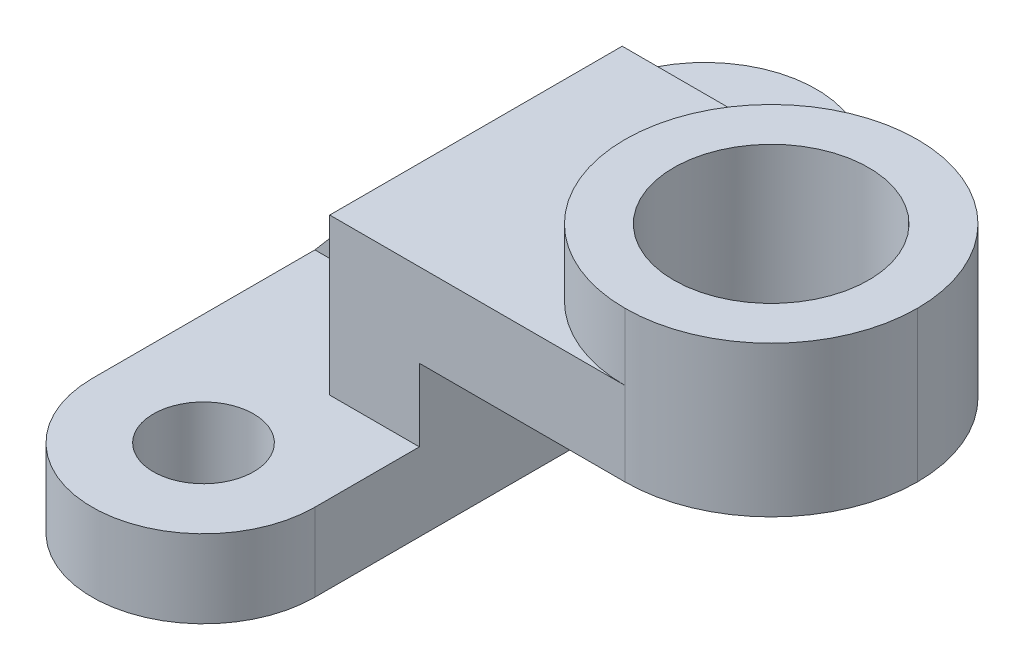
ISO-10303-21;
HEADER;
FILE_DESCRIPTION(('STEP AP214'),'2;1');
FILE_NAME('part.step','',(''),(''),'','','');
FILE_SCHEMA(('AUTOMOTIVE_DESIGN { 1 0 10303 214 1 1 1 1 }'));
ENDSEC;
DATA;
#1=APPLICATION_CONTEXT('core data for automotive mechanical design processes');
#2=APPLICATION_PROTOCOL_DEFINITION('international standard','automotive_design',2000,#1);
#3=PRODUCT_CONTEXT('',#1,'mechanical');
#4=PRODUCT('Part','Part','',(#3));
#5=PRODUCT_RELATED_PRODUCT_CATEGORY('part','',(#4));
#6=PRODUCT_DEFINITION_FORMATION('','',#4);
#7=PRODUCT_DEFINITION_CONTEXT('part definition',#1,'design');
#8=PRODUCT_DEFINITION('design','',#6,#7);
#9=PRODUCT_DEFINITION_SHAPE('','',#8);
#10=(LENGTH_UNIT() NAMED_UNIT(*) SI_UNIT(.MILLI.,.METRE.));
#11=(NAMED_UNIT(*) PLANE_ANGLE_UNIT() SI_UNIT($,.RADIAN.));
#12=(NAMED_UNIT(*) SI_UNIT($,.STERADIAN.) SOLID_ANGLE_UNIT());
#13=UNCERTAINTY_MEASURE_WITH_UNIT(LENGTH_MEASURE(1.E-05),#10,'distance_accuracy_value','');
#14=(GEOMETRIC_REPRESENTATION_CONTEXT(3) GLOBAL_UNCERTAINTY_ASSIGNED_CONTEXT((#13)) GLOBAL_UNIT_ASSIGNED_CONTEXT((#10,
#11,#12)) REPRESENTATION_CONTEXT('',''));
#15=CARTESIAN_POINT('',(0.,0.,0.));
#16=DIRECTION('',(0.,0.,1.));
#17=DIRECTION('',(1.,0.,0.));
#18=AXIS2_PLACEMENT_3D('',#15,#16,#17);
#19=CARTESIAN_POINT('',(-68.9044879536387,-51.4852491825803,52.5));
#20=DIRECTION('',(1.,0.,0.));
#21=DIRECTION('',(0.,1.,0.));
#22=AXIS2_PLACEMENT_3D('',#19,#20,#21);
#23=PLANE('',#22);
#24=DIRECTION('',(0.,-1.,0.));
#25=VECTOR('',#24,1.);
#26=CARTESIAN_POINT('',(-68.9044879536387,-51.4852491825803,-10.));
#27=LINE('',#26,#25);
#28=CARTESIAN_POINT('',(-68.9044879536387,4.51475081741969,-10.));
#29=VERTEX_POINT('',#28);
#30=CARTESIAN_POINT('',(-68.9044879536387,-51.4852491825803,-9.99999999999999));
#31=VERTEX_POINT('',#30);
#32=EDGE_CURVE('E166',#29,#31,#27,.T.);
#33=ORIENTED_EDGE('',*,*,#32,.F.);
#34=DIRECTION('',(0.,0.,-1.));
#35=VECTOR('',#34,1.);
#36=CARTESIAN_POINT('',(-68.9044879536387,4.51475081741969,52.5));
#37=LINE('',#36,#35);
#38=CARTESIAN_POINT('',(-68.9044879536387,4.51475081741969,-52.5));
#39=VERTEX_POINT('',#38);
#40=EDGE_CURVE('E175',#29,#39,#37,.T.);
#41=ORIENTED_EDGE('',*,*,#40,.T.);
#42=DIRECTION('',(0.,-1.,0.));
#43=VECTOR('',#42,1.);
#44=CARTESIAN_POINT('',(-68.9044879536387,-51.4852491825803,-52.5));
#45=LINE('',#44,#43);
#46=CARTESIAN_POINT('',(-68.9044879536387,-51.4852491825803,-52.5));
#47=VERTEX_POINT('',#46);
#48=EDGE_CURVE('E266',#39,#47,#45,.T.);
#49=ORIENTED_EDGE('',*,*,#48,.T.);
#50=DIRECTION('',(0.,0.,-1.));
#51=VECTOR('',#50,1.);
#52=CARTESIAN_POINT('',(-68.9044879536387,-51.4852491825803,52.5));
#53=LINE('',#52,#51);
#54=EDGE_CURVE('E177',#31,#47,#53,.T.);
#55=ORIENTED_EDGE('',*,*,#54,.F.);
#56=EDGE_LOOP('',(#33,#41,#49,#55));
#57=FACE_BOUND('',#56,.T.);
#58=ADVANCED_FACE('F39',(#57),#23,.F.);
#59=CARTESIAN_POINT('',(-76.7310912790545,-51.4852491825803,90.));
#60=DIRECTION('',(0.,-1.,0.));
#61=DIRECTION('',(0.,0.,-1.));
#62=AXIS2_PLACEMENT_3D('',#59,#60,#61);
#63=PLANE('',#62);
#64=CARTESIAN_POINT('',(-76.7310912790545,-51.4852491825803,-90.));
#65=DIRECTION('',(0.,-1.,0.));
#66=DIRECTION('',(0.,0.,-1.));
#67=AXIS2_PLACEMENT_3D('',#64,#65,#66);
#68=CIRCLE('',#67,18.);
#69=CARTESIAN_POINT('',(-76.7310912790545,-51.4852491825803,-108.));
#70=VERTEX_POINT('',#69);
#71=EDGE_CURVE('E160',#70,#70,#68,.T.);
#72=ORIENTED_EDGE('',*,*,#71,.T.);
#73=EDGE_LOOP('',(#72));
#74=FACE_BOUND('',#73,.T.);
#75=DIRECTION('',(-1.,0.,0.));
#76=VECTOR('',#75,1.);
#77=CARTESIAN_POINT('',(-76.7310912790545,-51.4852491825803,-9.99999999999999));
#78=LINE('',#77,#76);
#79=CARTESIAN_POINT('',(-116.731091279054,-51.4852491825803,-9.99999999999999));
#80=VERTEX_POINT('',#79);
#81=EDGE_CURVE('E168',#31,#80,#78,.T.);
#82=ORIENTED_EDGE('',*,*,#81,.F.);
#83=ORIENTED_EDGE('',*,*,#54,.T.);
#84=DIRECTION('',(1.,0.,0.));
#85=VECTOR('',#84,1.);
#86=CARTESIAN_POINT('',(-36.7310912790545,-51.4852491825803,-52.5));
#87=LINE('',#86,#85);
#88=CARTESIAN_POINT('',(-36.7310912790545,-51.4852491825803,-52.5));
#89=VERTEX_POINT('',#88);
#90=EDGE_CURVE('E241',#47,#89,#87,.T.);
#91=ORIENTED_EDGE('',*,*,#90,.T.);
#92=DIRECTION('',(0.,0.,1.));
#93=VECTOR('',#92,1.);
#94=CARTESIAN_POINT('',(-36.7310912790545,-51.4852491825803,90.));
#95=LINE('',#94,#93);
#96=CARTESIAN_POINT('',(-36.7310912790545,-51.4852491825803,-90.));
#97=VERTEX_POINT('',#96);
#98=EDGE_CURVE('E300',#97,#89,#95,.T.);
#99=ORIENTED_EDGE('',*,*,#98,.F.);
#100=CARTESIAN_POINT('',(-76.7310912790545,-51.4852491825803,-90.));
#101=DIRECTION('',(0.,-1.,0.));
#102=DIRECTION('',(0.,0.,-1.));
#103=AXIS2_PLACEMENT_3D('',#100,#101,#102);
#104=CIRCLE('',#103,40.);
#105=CARTESIAN_POINT('',(-116.731091279054,-51.4852491825803,-90.));
#106=VERTEX_POINT('',#105);
#107=EDGE_CURVE('E314',#106,#97,#104,.T.);
#108=ORIENTED_EDGE('',*,*,#107,.F.);
#109=DIRECTION('',(0.,0.,-1.));
#110=VECTOR('',#109,1.);
#111=CARTESIAN_POINT('',(-116.731091279054,-51.4852491825803,90.));
#112=LINE('',#111,#110);
#113=EDGE_CURVE('E526',#80,#106,#112,.T.);
#114=ORIENTED_EDGE('',*,*,#113,.F.);
#115=EDGE_LOOP('',(#82,#83,#91,#99,#108,#114));
#116=FACE_BOUND('',#115,.T.);
#117=ADVANCED_FACE('F290',(#74,#116),#63,.F.);
#118=CARTESIAN_POINT('',(-36.7310912790545,-25.4852491825803,52.5));
#119=DIRECTION('',(-1.,0.,0.));
#120=DIRECTION('',(0.,0.,1.));
#121=AXIS2_PLACEMENT_3D('',#118,#119,#120);
#122=PLANE('',#121);
#123=DIRECTION('',(0.,1.,0.));
#124=VECTOR('',#123,1.);
#125=CARTESIAN_POINT('',(-36.7310912790545,-79.4852491825803,90.));
#126=LINE('',#125,#124);
#127=CARTESIAN_POINT('',(-36.7310912790545,-79.4852491825803,90.));
#128=VERTEX_POINT('',#127);
#129=CARTESIAN_POINT('',(-36.7310912790545,-51.4852491825803,90.));
#130=VERTEX_POINT('',#129);
#131=EDGE_CURVE('E318',#128,#130,#126,.T.);
#132=ORIENTED_EDGE('',*,*,#131,.F.);
#133=DIRECTION('',(0.,0.,1.));
#134=VECTOR('',#133,1.);
#135=CARTESIAN_POINT('',(-36.7310912790545,-79.4852491825803,90.));
#136=LINE('',#135,#134);
#137=CARTESIAN_POINT('',(-36.7310912790545,-79.4852491825803,-90.));
#138=VERTEX_POINT('',#137);
#139=EDGE_CURVE('E322',#138,#128,#136,.T.);
#140=ORIENTED_EDGE('',*,*,#139,.F.);
#141=DIRECTION('',(0.,1.,0.));
#142=VECTOR('',#141,1.);
#143=CARTESIAN_POINT('',(-36.7310912790545,-79.4852491825803,-90.));
#144=LINE('',#143,#142);
#145=EDGE_CURVE('E303',#138,#97,#144,.T.);
#146=ORIENTED_EDGE('',*,*,#145,.T.);
#147=ORIENTED_EDGE('',*,*,#98,.T.);
#148=DIRECTION('',(0.,1.,0.));
#149=VECTOR('',#148,1.);
#150=CARTESIAN_POINT('',(-36.7310912790545,-25.4852491825803,-52.5));
#151=LINE('',#150,#149);
#152=CARTESIAN_POINT('',(-36.7310912790545,-25.4852491825803,-52.5));
#153=VERTEX_POINT('',#152);
#154=EDGE_CURVE('E248',#89,#153,#151,.T.);
#155=ORIENTED_EDGE('',*,*,#154,.T.);
#156=DIRECTION('',(0.,0.,-1.));
#157=VECTOR('',#156,1.);
#158=CARTESIAN_POINT('',(-36.7310912790545,-25.4852491825803,52.5));
#159=LINE('',#158,#157);
#160=CARTESIAN_POINT('',(-36.7310912790545,-25.4852491825803,52.5));
#161=VERTEX_POINT('',#160);
#162=EDGE_CURVE('E191',#161,#153,#159,.T.);
#163=ORIENTED_EDGE('',*,*,#162,.F.);
#164=DIRECTION('',(0.,1.,0.));
#165=VECTOR('',#164,1.);
#166=CARTESIAN_POINT('',(-36.7310912790545,-25.4852491825803,52.5));
#167=LINE('',#166,#165);
#168=CARTESIAN_POINT('',(-36.7310912790545,-51.4852491825803,52.5));
#169=VERTEX_POINT('',#168);
#170=EDGE_CURVE('E271',#169,#161,#167,.T.);
#171=ORIENTED_EDGE('',*,*,#170,.F.);
#172=EDGE_CURVE('E307',#169,#130,#95,.T.);
#173=ORIENTED_EDGE('',*,*,#172,.T.);
#174=EDGE_LOOP('',(#132,#140,#146,#147,#155,#163,#171,#173));
#175=FACE_BOUND('',#174,.T.);
#176=ADVANCED_FACE('F297',(#175),#122,.F.);
#177=CARTESIAN_POINT('',(89.5955120463612,-25.4852491825803,52.5));
#178=DIRECTION('',(0.,1.,0.));
#179=DIRECTION('',(-1.,0.,0.));
#180=AXIS2_PLACEMENT_3D('',#177,#178,#179);
#181=PLANE('',#180);
#182=CARTESIAN_POINT('',(37.0955120463612,-25.4852491825803,0.));
#183=DIRECTION('',(0.,1.,0.));
#184=DIRECTION('',(-1.,0.,0.));
#185=AXIS2_PLACEMENT_3D('',#182,#183,#184);
#186=CIRCLE('',#185,35.);
#187=CARTESIAN_POINT('',(2.09551204636123,-25.4852491825803,0.));
#188=VERTEX_POINT('',#187);
#189=EDGE_CURVE('E230',#188,#188,#186,.T.);
#190=ORIENTED_EDGE('',*,*,#189,.T.);
#191=EDGE_LOOP('',(#190));
#192=FACE_BOUND('',#191,.T.);
#193=ORIENTED_EDGE('',*,*,#162,.T.);
#194=DIRECTION('',(1.,0.,0.));
#195=VECTOR('',#194,1.);
#196=CARTESIAN_POINT('',(89.5955120463612,-25.4852491825803,-52.5));
#197=LINE('',#196,#195);
#198=CARTESIAN_POINT('',(37.0955120463612,-25.4852491825803,-52.5));
#199=VERTEX_POINT('',#198);
#200=EDGE_CURVE('E256',#153,#199,#197,.T.);
#201=ORIENTED_EDGE('',*,*,#200,.T.);
#202=CARTESIAN_POINT('',(37.0955120463612,-25.4852491825803,0.));
#203=DIRECTION('',(0.,1.,0.));
#204=DIRECTION('',(-1.,0.,0.));
#205=AXIS2_PLACEMENT_3D('',#202,#203,#204);
#206=CIRCLE('',#205,52.5);
#207=CARTESIAN_POINT('',(89.5955120463612,-25.4852491825803,0.));
#208=VERTEX_POINT('',#207);
#209=EDGE_CURVE('E217',#199,#208,#206,.F.);
#210=ORIENTED_EDGE('',*,*,#209,.T.);
#211=CARTESIAN_POINT('',(37.0955120463612,-25.4852491825803,0.));
#212=DIRECTION('',(0.,1.,0.));
#213=DIRECTION('',(-1.,0.,0.));
#214=AXIS2_PLACEMENT_3D('',#211,#212,#213);
#215=CIRCLE('',#214,52.5);
#216=CARTESIAN_POINT('',(37.0955120463612,-25.4852491825803,52.5));
#217=VERTEX_POINT('',#216);
#218=EDGE_CURVE('E220',#208,#217,#215,.F.);
#219=ORIENTED_EDGE('',*,*,#218,.T.);
#220=DIRECTION('',(1.,0.,0.));
#221=VECTOR('',#220,1.);
#222=CARTESIAN_POINT('',(89.5955120463612,-25.4852491825803,52.5));
#223=LINE('',#222,#221);
#224=EDGE_CURVE('E277',#161,#217,#223,.T.);
#225=ORIENTED_EDGE('',*,*,#224,.F.);
#226=EDGE_LOOP('',(#193,#201,#210,#219,#225));
#227=FACE_BOUND('',#226,.T.);
#228=ADVANCED_FACE('F341',(#192,#227),#181,.F.);
#229=CARTESIAN_POINT('',(-15.4044879536388,28.5147508174197,52.5));
#230=DIRECTION('',(0.,-1.,0.));
#231=DIRECTION('',(0.,0.,-1.));
#232=AXIS2_PLACEMENT_3D('',#229,#230,#231);
#233=PLANE('',#232);
#234=CARTESIAN_POINT('',(37.0955120463612,28.5147508174197,0.));
#235=DIRECTION('',(0.,1.,0.));
#236=DIRECTION('',(0.,0.,1.));
#237=AXIS2_PLACEMENT_3D('',#234,#235,#236);
#238=CIRCLE('',#237,35.);
#239=CARTESIAN_POINT('',(37.0955120463612,28.5147508174197,35.));
#240=VERTEX_POINT('',#239);
#241=EDGE_CURVE('E332',#240,#240,#238,.T.);
#242=ORIENTED_EDGE('',*,*,#241,.F.);
#243=EDGE_LOOP('',(#242));
#244=FACE_BOUND('',#243,.T.);
#245=CARTESIAN_POINT('',(37.0955120463612,28.5147508174197,0.));
#246=DIRECTION('',(0.,-1.,0.));
#247=DIRECTION('',(0.,0.,-1.));
#248=AXIS2_PLACEMENT_3D('',#245,#246,#247);
#249=CIRCLE('',#248,52.5);
#250=CARTESIAN_POINT('',(37.0955120463612,28.5147508174197,52.5));
#251=VERTEX_POINT('',#250);
#252=CARTESIAN_POINT('',(89.5955120463612,28.5147508174197,0.));
#253=VERTEX_POINT('',#252);
#254=EDGE_CURVE('E204',#251,#253,#249,.F.);
#255=ORIENTED_EDGE('',*,*,#254,.T.);
#256=CARTESIAN_POINT('',(37.0955120463612,28.5147508174197,0.));
#257=DIRECTION('',(0.,-1.,0.));
#258=DIRECTION('',(0.,0.,-1.));
#259=AXIS2_PLACEMENT_3D('',#256,#257,#258);
#260=CIRCLE('',#259,52.5);
#261=CARTESIAN_POINT('',(37.0955120463612,28.5147508174197,-52.5));
#262=VERTEX_POINT('',#261);
#263=EDGE_CURVE('E201',#253,#262,#260,.F.);
#264=ORIENTED_EDGE('',*,*,#263,.T.);
#265=CARTESIAN_POINT('',(37.0955120463612,28.5147508174197,0.));
#266=DIRECTION('',(0.,-1.,0.));
#267=DIRECTION('',(0.,0.,-1.));
#268=AXIS2_PLACEMENT_3D('',#265,#266,#267);
#269=CIRCLE('',#268,52.5);
#270=CARTESIAN_POINT('',(-15.4044879536388,28.5147508174197,0.));
#271=VERTEX_POINT('',#270);
#272=EDGE_CURVE('E210',#262,#271,#269,.F.);
#273=ORIENTED_EDGE('',*,*,#272,.T.);
#274=CARTESIAN_POINT('',(37.0955120463612,28.5147508174197,0.));
#275=DIRECTION('',(0.,-1.,0.));
#276=DIRECTION('',(0.,0.,-1.));
#277=AXIS2_PLACEMENT_3D('',#274,#275,#276);
#278=CIRCLE('',#277,52.5);
#279=EDGE_CURVE('E207',#271,#251,#278,.F.);
#280=ORIENTED_EDGE('',*,*,#279,.T.);
#281=EDGE_LOOP('',(#255,#264,#273,#280));
#282=FACE_BOUND('',#281,.T.);
#283=ADVANCED_FACE('F377',(#244,#282),#233,.F.);
#284=CARTESIAN_POINT('',(-68.9044879536387,4.51475081741969,52.5));
#285=DIRECTION('',(0.,-1.,0.));
#286=DIRECTION('',(0.,0.,-1.));
#287=AXIS2_PLACEMENT_3D('',#284,#285,#286);
#288=PLANE('',#287);
#289=CARTESIAN_POINT('',(37.0955120463612,4.51475081741969,0.));
#290=DIRECTION('',(0.,-1.,0.));
#291=DIRECTION('',(0.,0.,-1.));
#292=AXIS2_PLACEMENT_3D('',#289,#290,#291);
#293=CIRCLE('',#292,52.5);
#294=CARTESIAN_POINT('',(37.0955120463612,4.51475081741969,52.5));
#295=VERTEX_POINT('',#294);
#296=CARTESIAN_POINT('',(-15.4044879536388,4.51475081741969,0.));
#297=VERTEX_POINT('',#296);
#298=EDGE_CURVE('E11',#295,#297,#293,.T.);
#299=ORIENTED_EDGE('',*,*,#298,.T.);
#300=CARTESIAN_POINT('',(37.0955120463612,4.51475081741969,0.));
#301=DIRECTION('',(0.,-1.,0.));
#302=DIRECTION('',(0.,0.,-1.));
#303=AXIS2_PLACEMENT_3D('',#300,#301,#302);
#304=CIRCLE('',#303,52.5);
#305=CARTESIAN_POINT('',(37.0955120463612,4.51475081741969,-52.5));
#306=VERTEX_POINT('',#305);
#307=EDGE_CURVE('E49',#297,#306,#304,.T.);
#308=ORIENTED_EDGE('',*,*,#307,.T.);
#309=DIRECTION('',(-1.,0.,0.));
#310=VECTOR('',#309,1.);
#311=CARTESIAN_POINT('',(-68.9044879536387,4.51475081741969,-52.5));
#312=LINE('',#311,#310);
#313=EDGE_CURVE('E183',#306,#39,#312,.T.);
#314=ORIENTED_EDGE('',*,*,#313,.T.);
#315=ORIENTED_EDGE('',*,*,#40,.F.);
#316=DIRECTION('',(0.,0.,1.));
#317=VECTOR('',#316,1.);
#318=CARTESIAN_POINT('',(-68.9044879536387,4.51475081741969,52.5));
#319=LINE('',#318,#317);
#320=CARTESIAN_POINT('',(-68.9044879536387,4.51475081741969,10.));
#321=VERTEX_POINT('',#320);
#322=EDGE_CURVE('E152',#29,#321,#319,.T.);
#323=ORIENTED_EDGE('',*,*,#322,.T.);
#324=CARTESIAN_POINT('',(-68.9044879536387,4.51475081741969,52.5));
#325=VERTEX_POINT('',#324);
#326=EDGE_CURVE('E186',#325,#321,#37,.T.);
#327=ORIENTED_EDGE('',*,*,#326,.F.);
#328=DIRECTION('',(-1.,0.,0.));
#329=VECTOR('',#328,1.);
#330=CARTESIAN_POINT('',(-68.9044879536387,4.51475081741969,52.5));
#331=LINE('',#330,#329);
#332=EDGE_CURVE('E284',#295,#325,#331,.T.);
#333=ORIENTED_EDGE('',*,*,#332,.F.);
#334=EDGE_LOOP('',(#299,#308,#314,#315,#323,#327,#333));
#335=FACE_BOUND('',#334,.T.);
#336=ADVANCED_FACE('F181',(#335),#288,.F.);
#337=ORIENTED_EDGE('',*,*,#326,.T.);
#338=DIRECTION('',(0.,-1.,0.));
#339=VECTOR('',#338,1.);
#340=CARTESIAN_POINT('',(-68.9044879536387,-51.4852491825803,10.));
#341=LINE('',#340,#339);
#342=CARTESIAN_POINT('',(-68.9044879536387,-51.4852491825803,9.99999999999999));
#343=VERTEX_POINT('',#342);
#344=EDGE_CURVE('E161',#321,#343,#341,.T.);
#345=ORIENTED_EDGE('',*,*,#344,.T.);
#346=CARTESIAN_POINT('',(-68.9044879536387,-51.4852491825803,52.5));
#347=VERTEX_POINT('',#346);
#348=EDGE_CURVE('E187',#347,#343,#53,.T.);
#349=ORIENTED_EDGE('',*,*,#348,.F.);
#350=DIRECTION('',(0.,-1.,0.));
#351=VECTOR('',#350,1.);
#352=CARTESIAN_POINT('',(-68.9044879536387,-51.4852491825803,52.5));
#353=LINE('',#352,#351);
#354=EDGE_CURVE('E259',#325,#347,#353,.T.);
#355=ORIENTED_EDGE('',*,*,#354,.F.);
#356=EDGE_LOOP('',(#337,#345,#349,#355));
#357=FACE_BOUND('',#356,.T.);
#358=ADVANCED_FACE('F363',(#357),#23,.F.);
#359=CARTESIAN_POINT('',(0.,0.,52.5));
#360=DIRECTION('',(0.,0.,-1.));
#361=DIRECTION('',(-1.,0.,0.));
#362=AXIS2_PLACEMENT_3D('',#359,#360,#361);
#363=PLANE('',#362);
#364=DIRECTION('',(0.,1.,0.));
#365=VECTOR('',#364,1.);
#366=CARTESIAN_POINT('',(37.0955120463612,0.,52.5));
#367=LINE('',#366,#365);
#368=EDGE_CURVE('E213',#217,#295,#367,.T.);
#369=ORIENTED_EDGE('',*,*,#368,.T.);
#370=ORIENTED_EDGE('',*,*,#332,.T.);
#371=ORIENTED_EDGE('',*,*,#354,.T.);
#372=DIRECTION('',(1.,0.,0.));
#373=VECTOR('',#372,1.);
#374=CARTESIAN_POINT('',(-36.7310912790545,-51.4852491825803,52.5));
#375=LINE('',#374,#373);
#376=EDGE_CURVE('E268',#347,#169,#375,.T.);
#377=ORIENTED_EDGE('',*,*,#376,.T.);
#378=ORIENTED_EDGE('',*,*,#170,.T.);
#379=ORIENTED_EDGE('',*,*,#224,.T.);
#380=EDGE_LOOP('',(#369,#370,#371,#377,#378,#379));
#381=FACE_BOUND('',#380,.T.);
#382=ADVANCED_FACE('F371',(#381),#363,.F.);
#383=CARTESIAN_POINT('',(0.,0.,-52.5));
#384=DIRECTION('',(0.,0.,-1.));
#385=DIRECTION('',(-1.,0.,0.));
#386=AXIS2_PLACEMENT_3D('',#383,#384,#385);
#387=PLANE('',#386);
#388=ORIENTED_EDGE('',*,*,#313,.F.);
#389=DIRECTION('',(0.,1.,0.));
#390=VECTOR('',#389,1.);
#391=CARTESIAN_POINT('',(37.0955120463612,-25.4852491825803,-52.5));
#392=LINE('',#391,#390);
#393=EDGE_CURVE('E198',#306,#199,#392,.F.);
#394=ORIENTED_EDGE('',*,*,#393,.T.);
#395=ORIENTED_EDGE('',*,*,#200,.F.);
#396=ORIENTED_EDGE('',*,*,#154,.F.);
#397=ORIENTED_EDGE('',*,*,#90,.F.);
#398=ORIENTED_EDGE('',*,*,#48,.F.);
#399=EDGE_LOOP('',(#388,#394,#395,#396,#397,#398));
#400=FACE_BOUND('',#399,.T.);
#401=ADVANCED_FACE('F292',(#400),#387,.T.);
#402=CARTESIAN_POINT('',(37.0955120463612,0.,0.));
#403=DIRECTION('',(0.,1.,0.));
#404=DIRECTION('',(0.,0.,1.));
#405=AXIS2_PLACEMENT_3D('',#402,#403,#404);
#406=CYLINDRICAL_SURFACE('',#405,52.5);
#407=ORIENTED_EDGE('',*,*,#368,.F.);
#408=ORIENTED_EDGE('',*,*,#218,.F.);
#409=DIRECTION('',(0.,1.,0.));
#410=VECTOR('',#409,1.);
#411=CARTESIAN_POINT('',(89.5955120463612,28.5147508174197,0.));
#412=LINE('',#411,#410);
#413=EDGE_CURVE('E43',#253,#208,#412,.F.);
#414=ORIENTED_EDGE('',*,*,#413,.F.);
#415=ORIENTED_EDGE('',*,*,#254,.F.);
#416=DIRECTION('',(0.,1.,0.));
#417=VECTOR('',#416,1.);
#418=CARTESIAN_POINT('',(37.0955120463612,0.,52.5));
#419=LINE('',#418,#417);
#420=EDGE_CURVE('E233',#295,#251,#419,.T.);
#421=ORIENTED_EDGE('',*,*,#420,.F.);
#422=EDGE_LOOP('',(#407,#408,#414,#415,#421));
#423=FACE_BOUND('',#422,.T.);
#424=ADVANCED_FACE('F41',(#423),#406,.T.);
#425=CARTESIAN_POINT('',(37.0955120463612,28.5147508174197,0.));
#426=DIRECTION('',(0.,-1.,0.));
#427=DIRECTION('',(0.,0.,-1.));
#428=AXIS2_PLACEMENT_3D('',#425,#426,#427);
#429=CYLINDRICAL_SURFACE('',#428,52.5);
#430=ORIENTED_EDGE('',*,*,#413,.T.);
#431=ORIENTED_EDGE('',*,*,#209,.F.);
#432=ORIENTED_EDGE('',*,*,#393,.F.);
#433=DIRECTION('',(0.,1.,0.));
#434=VECTOR('',#433,1.);
#435=CARTESIAN_POINT('',(37.0955120463612,-25.4852491825803,-52.5));
#436=LINE('',#435,#434);
#437=EDGE_CURVE('E229',#262,#306,#436,.F.);
#438=ORIENTED_EDGE('',*,*,#437,.F.);
#439=ORIENTED_EDGE('',*,*,#263,.F.);
#440=EDGE_LOOP('',(#430,#431,#432,#438,#439));
#441=FACE_BOUND('',#440,.T.);
#442=ADVANCED_FACE('F387',(#441),#429,.T.);
#443=CARTESIAN_POINT('',(37.0955120463612,0.,0.));
#444=DIRECTION('',(0.,-1.,0.));
#445=DIRECTION('',(0.,0.,-1.));
#446=AXIS2_PLACEMENT_3D('',#443,#444,#445);
#447=CYLINDRICAL_SURFACE('',#446,52.5);
#448=ORIENTED_EDGE('',*,*,#420,.T.);
#449=ORIENTED_EDGE('',*,*,#279,.F.);
#450=DIRECTION('',(0.,-1.,0.));
#451=VECTOR('',#450,1.);
#452=CARTESIAN_POINT('',(-15.4044879536388,4.51475081741969,0.));
#453=LINE('',#452,#451);
#454=EDGE_CURVE('E225',#297,#271,#453,.F.);
#455=ORIENTED_EDGE('',*,*,#454,.F.);
#456=ORIENTED_EDGE('',*,*,#298,.F.);
#457=EDGE_LOOP('',(#448,#449,#455,#456));
#458=FACE_BOUND('',#457,.T.);
#459=ADVANCED_FACE('F356',(#458),#447,.T.);
#460=CARTESIAN_POINT('',(37.0955120463612,4.51475081741969,0.));
#461=DIRECTION('',(0.,1.,0.));
#462=DIRECTION('',(0.,0.,1.));
#463=AXIS2_PLACEMENT_3D('',#460,#461,#462);
#464=CYLINDRICAL_SURFACE('',#463,52.5);
#465=ORIENTED_EDGE('',*,*,#454,.T.);
#466=ORIENTED_EDGE('',*,*,#272,.F.);
#467=ORIENTED_EDGE('',*,*,#437,.T.);
#468=ORIENTED_EDGE('',*,*,#307,.F.);
#469=EDGE_LOOP('',(#465,#466,#467,#468));
#470=FACE_BOUND('',#469,.T.);
#471=ADVANCED_FACE('F347',(#470),#464,.T.);
#472=CARTESIAN_POINT('',(37.0955120463612,-76.4852491825803,0.));
#473=DIRECTION('',(0.,1.,0.));
#474=DIRECTION('',(0.,0.,1.));
#475=AXIS2_PLACEMENT_3D('',#472,#473,#474);
#476=CYLINDRICAL_SURFACE('',#475,35.);
#477=ORIENTED_EDGE('',*,*,#189,.F.);
#478=EDGE_LOOP('',(#477));
#479=FACE_BOUND('',#478,.T.);
#480=ORIENTED_EDGE('',*,*,#241,.T.);
#481=EDGE_LOOP('',(#480));
#482=FACE_BOUND('',#481,.T.);
#483=ADVANCED_FACE('F344',(#479,#482),#476,.F.);
#484=CARTESIAN_POINT('',(-76.7310912790545,-51.4852491825803,90.));
#485=DIRECTION('',(0.,-1.,0.));
#486=DIRECTION('',(0.,0.,-1.));
#487=AXIS2_PLACEMENT_3D('',#484,#485,#486);
#488=CIRCLE('',#487,18.);
#489=CARTESIAN_POINT('',(-76.7310912790545,-51.4852491825803,72.));
#490=VERTEX_POINT('',#489);
#491=EDGE_CURVE('E534',#490,#490,#488,.T.);
#492=ORIENTED_EDGE('',*,*,#491,.T.);
#493=EDGE_LOOP('',(#492));
#494=FACE_BOUND('',#493,.T.);
#495=ORIENTED_EDGE('',*,*,#348,.T.);
#496=DIRECTION('',(-1.,0.,0.));
#497=VECTOR('',#496,1.);
#498=CARTESIAN_POINT('',(-76.7310912790545,-51.4852491825803,9.99999999999999));
#499=LINE('',#498,#497);
#500=CARTESIAN_POINT('',(-116.731091279054,-51.4852491825803,10.));
#501=VERTEX_POINT('',#500);
#502=EDGE_CURVE('E179',#343,#501,#499,.T.);
#503=ORIENTED_EDGE('',*,*,#502,.T.);
#504=CARTESIAN_POINT('',(-116.731091279054,-51.4852491825803,90.));
#505=VERTEX_POINT('',#504);
#506=EDGE_CURVE('E532',#505,#501,#112,.T.);
#507=ORIENTED_EDGE('',*,*,#506,.F.);
#508=CARTESIAN_POINT('',(-76.7310912790545,-51.4852491825803,90.));
#509=DIRECTION('',(0.,-1.,0.));
#510=DIRECTION('',(0.,0.,-1.));
#511=AXIS2_PLACEMENT_3D('',#508,#509,#510);
#512=CIRCLE('',#511,40.);
#513=EDGE_CURVE('E522',#130,#505,#512,.T.);
#514=ORIENTED_EDGE('',*,*,#513,.F.);
#515=ORIENTED_EDGE('',*,*,#172,.F.);
#516=ORIENTED_EDGE('',*,*,#376,.F.);
#517=EDGE_LOOP('',(#495,#503,#507,#514,#515,#516));
#518=FACE_BOUND('',#517,.T.);
#519=ADVANCED_FACE('F346',(#494,#518),#63,.F.);
#520=CARTESIAN_POINT('',(-76.7310912790545,-79.4852491825803,90.));
#521=DIRECTION('',(0.,-1.,0.));
#522=DIRECTION('',(0.,0.,-1.));
#523=AXIS2_PLACEMENT_3D('',#520,#521,#522);
#524=PLANE('',#523);
#525=DIRECTION('',(0.,0.,-1.));
#526=VECTOR('',#525,1.);
#527=CARTESIAN_POINT('',(-116.731091279054,-79.4852491825803,90.));
#528=LINE('',#527,#526);
#529=CARTESIAN_POINT('',(-116.731091279054,-79.4852491825803,90.));
#530=VERTEX_POINT('',#529);
#531=CARTESIAN_POINT('',(-116.731091279054,-79.4852491825803,-90.));
#532=VERTEX_POINT('',#531);
#533=EDGE_CURVE('E312',#530,#532,#528,.T.);
#534=ORIENTED_EDGE('',*,*,#533,.T.);
#535=CARTESIAN_POINT('',(-76.7310912790545,-79.4852491825803,-90.));
#536=DIRECTION('',(0.,-1.,0.));
#537=DIRECTION('',(0.,0.,-1.));
#538=AXIS2_PLACEMENT_3D('',#535,#536,#537);
#539=CIRCLE('',#538,40.);
#540=EDGE_CURVE('E564',#532,#138,#539,.T.);
#541=ORIENTED_EDGE('',*,*,#540,.T.);
#542=ORIENTED_EDGE('',*,*,#139,.T.);
#543=CARTESIAN_POINT('',(-76.7310912790545,-79.4852491825803,90.));
#544=DIRECTION('',(0.,-1.,0.));
#545=DIRECTION('',(0.,0.,-1.));
#546=AXIS2_PLACEMENT_3D('',#543,#544,#545);
#547=CIRCLE('',#546,40.);
#548=EDGE_CURVE('E306',#128,#530,#547,.T.);
#549=ORIENTED_EDGE('',*,*,#548,.T.);
#550=EDGE_LOOP('',(#534,#541,#542,#549));
#551=FACE_BOUND('',#550,.T.);
#552=CARTESIAN_POINT('',(-76.7310912790545,-79.4852491825803,90.));
#553=DIRECTION('',(0.,-1.,0.));
#554=DIRECTION('',(0.,0.,-1.));
#555=AXIS2_PLACEMENT_3D('',#552,#553,#554);
#556=CIRCLE('',#555,18.);
#557=CARTESIAN_POINT('',(-76.7310912790545,-79.4852491825803,72.));
#558=VERTEX_POINT('',#557);
#559=EDGE_CURVE('E527',#558,#558,#556,.T.);
#560=ORIENTED_EDGE('',*,*,#559,.F.);
#561=EDGE_LOOP('',(#560));
#562=FACE_BOUND('',#561,.T.);
#563=CARTESIAN_POINT('',(-76.7310912790545,-79.4852491825803,-90.));
#564=DIRECTION('',(0.,-1.,0.));
#565=DIRECTION('',(0.,0.,-1.));
#566=AXIS2_PLACEMENT_3D('',#563,#564,#565);
#567=CIRCLE('',#566,18.);
#568=CARTESIAN_POINT('',(-76.7310912790545,-79.4852491825803,-108.));
#569=VERTEX_POINT('',#568);
#570=EDGE_CURVE('E553',#569,#569,#567,.T.);
#571=ORIENTED_EDGE('',*,*,#570,.F.);
#572=EDGE_LOOP('',(#571));
#573=FACE_BOUND('',#572,.T.);
#574=ADVANCED_FACE('F353',(#551,#562,#573),#524,.T.);
#575=CARTESIAN_POINT('',(-76.7310912790545,-79.4852491825803,90.));
#576=DIRECTION('',(0.,1.,0.));
#577=DIRECTION('',(0.,0.,1.));
#578=AXIS2_PLACEMENT_3D('',#575,#576,#577);
#579=CYLINDRICAL_SURFACE('',#578,40.);
#580=ORIENTED_EDGE('',*,*,#513,.T.);
#581=DIRECTION('',(0.,1.,0.));
#582=VECTOR('',#581,1.);
#583=CARTESIAN_POINT('',(-116.731091279054,-79.4852491825803,90.));
#584=LINE('',#583,#582);
#585=EDGE_CURVE('E329',#530,#505,#584,.T.);
#586=ORIENTED_EDGE('',*,*,#585,.F.);
#587=ORIENTED_EDGE('',*,*,#548,.F.);
#588=ORIENTED_EDGE('',*,*,#131,.T.);
#589=EDGE_LOOP('',(#580,#586,#587,#588));
#590=FACE_BOUND('',#589,.T.);
#591=ADVANCED_FACE('F459',(#590),#579,.T.);
#592=CARTESIAN_POINT('',(-116.731091279054,-79.4852491825803,90.));
#593=DIRECTION('',(1.,0.,0.));
#594=DIRECTION('',(0.,0.,-1.));
#595=AXIS2_PLACEMENT_3D('',#592,#593,#594);
#596=PLANE('',#595);
#597=ORIENTED_EDGE('',*,*,#506,.T.);
#598=EDGE_CURVE('E531',#501,#80,#112,.T.);
#599=ORIENTED_EDGE('',*,*,#598,.T.);
#600=ORIENTED_EDGE('',*,*,#113,.T.);
#601=DIRECTION('',(0.,1.,0.));
#602=VECTOR('',#601,1.);
#603=CARTESIAN_POINT('',(-116.731091279054,-79.4852491825803,-90.));
#604=LINE('',#603,#602);
#605=EDGE_CURVE('E325',#532,#106,#604,.T.);
#606=ORIENTED_EDGE('',*,*,#605,.F.);
#607=ORIENTED_EDGE('',*,*,#533,.F.);
#608=ORIENTED_EDGE('',*,*,#585,.T.);
#609=EDGE_LOOP('',(#597,#599,#600,#606,#607,#608));
#610=FACE_BOUND('',#609,.T.);
#611=ADVANCED_FACE('F467',(#610),#596,.F.);
#612=CARTESIAN_POINT('',(-76.7310912790545,-79.4852491825803,-90.));
#613=DIRECTION('',(0.,1.,0.));
#614=DIRECTION('',(0.,0.,1.));
#615=AXIS2_PLACEMENT_3D('',#612,#613,#614);
#616=CYLINDRICAL_SURFACE('',#615,40.);
#617=ORIENTED_EDGE('',*,*,#107,.T.);
#618=ORIENTED_EDGE('',*,*,#145,.F.);
#619=ORIENTED_EDGE('',*,*,#540,.F.);
#620=ORIENTED_EDGE('',*,*,#605,.T.);
#621=EDGE_LOOP('',(#617,#618,#619,#620));
#622=FACE_BOUND('',#621,.T.);
#623=ADVANCED_FACE('F472',(#622),#616,.T.);
#624=CARTESIAN_POINT('',(-76.7310912790545,-79.4852491825803,90.));
#625=DIRECTION('',(0.,1.,0.));
#626=DIRECTION('',(0.,0.,1.));
#627=AXIS2_PLACEMENT_3D('',#624,#625,#626);
#628=CYLINDRICAL_SURFACE('',#627,18.);
#629=ORIENTED_EDGE('',*,*,#559,.T.);
#630=EDGE_LOOP('',(#629));
#631=FACE_BOUND('',#630,.T.);
#632=ORIENTED_EDGE('',*,*,#491,.F.);
#633=EDGE_LOOP('',(#632));
#634=FACE_BOUND('',#633,.T.);
#635=ADVANCED_FACE('F510',(#631,#634),#628,.F.);
#636=CARTESIAN_POINT('',(-76.7310912790545,-79.4852491825803,-90.));
#637=DIRECTION('',(0.,1.,0.));
#638=DIRECTION('',(0.,0.,1.));
#639=AXIS2_PLACEMENT_3D('',#636,#637,#638);
#640=CYLINDRICAL_SURFACE('',#639,18.);
#641=ORIENTED_EDGE('',*,*,#570,.T.);
#642=EDGE_LOOP('',(#641));
#643=FACE_BOUND('',#642,.T.);
#644=ORIENTED_EDGE('',*,*,#71,.F.);
#645=EDGE_LOOP('',(#644));
#646=FACE_BOUND('',#645,.T.);
#647=ADVANCED_FACE('F485',(#643,#646),#640,.F.);
#648=CARTESIAN_POINT('',(-68.9044879536387,4.51475081741969,0.));
#649=DIRECTION('',(-0.760418807587271,0.649433011993965,0.));
#650=DIRECTION('',(-0.649433011993965,-0.760418807587271,0.));
#651=AXIS2_PLACEMENT_3D('',#648,#649,#650);
#652=PLANE('',#651);
#653=ORIENTED_EDGE('',*,*,#322,.F.);
#654=DIRECTION('',(-0.649433011993965,-0.760418807587271,0.));
#655=VECTOR('',#654,1.);
#656=CARTESIAN_POINT('',(-68.9044879536387,4.51475081741969,-10.));
#657=LINE('',#656,#655);
#658=EDGE_CURVE('E57',#29,#80,#657,.T.);
#659=ORIENTED_EDGE('',*,*,#658,.T.);
#660=ORIENTED_EDGE('',*,*,#598,.F.);
#661=DIRECTION('',(-0.649433011993965,-0.760418807587271,0.));
#662=VECTOR('',#661,1.);
#663=CARTESIAN_POINT('',(-68.9044879536387,4.51475081741969,10.));
#664=LINE('',#663,#662);
#665=EDGE_CURVE('E155',#321,#501,#664,.T.);
#666=ORIENTED_EDGE('',*,*,#665,.F.);
#667=EDGE_LOOP('',(#653,#659,#660,#666));
#668=FACE_BOUND('',#667,.T.);
#669=ADVANCED_FACE('F153',(#668),#652,.T.);
#670=CARTESIAN_POINT('',(-13.5677896163466,-25.4852491825803,10.));
#671=DIRECTION('',(0.,0.,1.));
#672=DIRECTION('',(1.,0.,0.));
#673=AXIS2_PLACEMENT_3D('',#670,#671,#672);
#674=PLANE('',#673);
#675=ORIENTED_EDGE('',*,*,#344,.F.);
#676=ORIENTED_EDGE('',*,*,#665,.T.);
#677=ORIENTED_EDGE('',*,*,#502,.F.);
#678=EDGE_LOOP('',(#675,#676,#677));
#679=FACE_BOUND('',#678,.T.);
#680=ADVANCED_FACE('F484',(#679),#674,.T.);
#681=CARTESIAN_POINT('',(-13.5677896163466,-25.4852491825803,-10.));
#682=DIRECTION('',(0.,0.,1.));
#683=DIRECTION('',(1.,0.,0.));
#684=AXIS2_PLACEMENT_3D('',#681,#682,#683);
#685=PLANE('',#684);
#686=ORIENTED_EDGE('',*,*,#658,.F.);
#687=ORIENTED_EDGE('',*,*,#32,.T.);
#688=ORIENTED_EDGE('',*,*,#81,.T.);
#689=EDGE_LOOP('',(#686,#687,#688));
#690=FACE_BOUND('',#689,.T.);
#691=ADVANCED_FACE('F165',(#690),#685,.F.);
#692=CLOSED_SHELL('',(#58,#117,#176,#228,#283,#336,#358,#382,#401,#424,#442,#459,#471,#483,#519,
#574,#591,#611,#623,#635,#647,#669,#680,#691));
#693=MANIFOLD_SOLID_BREP('B2',#692);
#694=ADVANCED_BREP_SHAPE_REPRESENTATION('',(#18,#693),#14);
#695=SHAPE_DEFINITION_REPRESENTATION(#9,#694);
ENDSEC;
END-ISO-10303-21;
